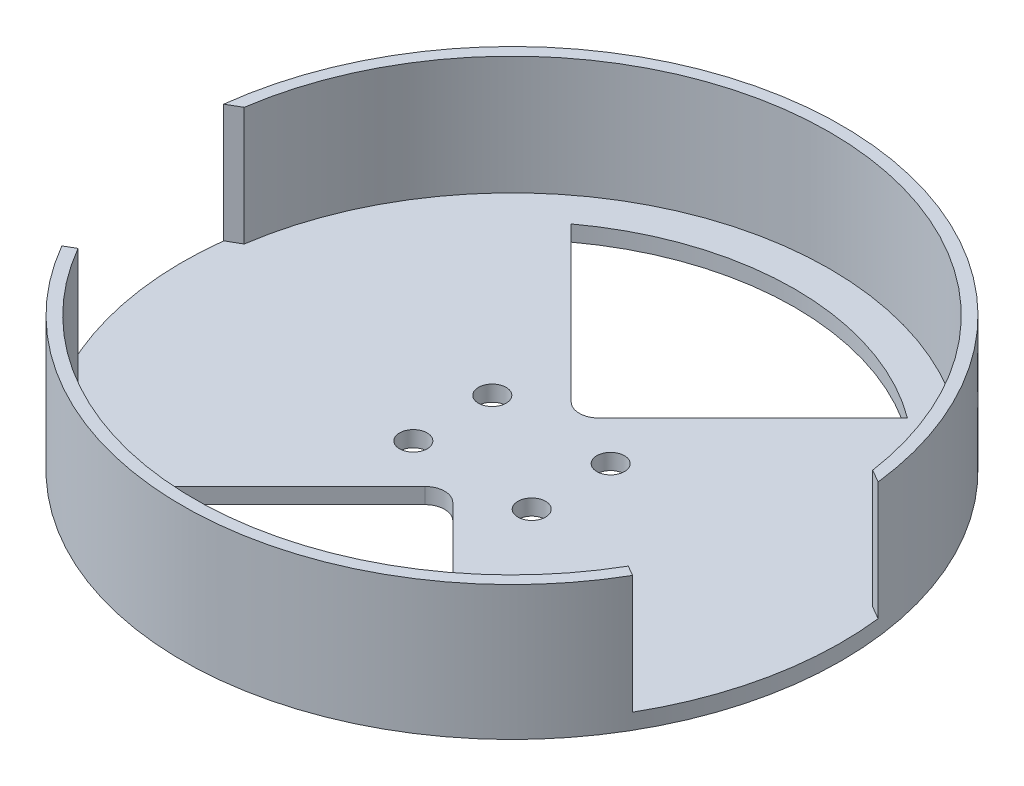
ISO-10303-21;
HEADER;
FILE_DESCRIPTION(('STEP AP214'),'2;1');
FILE_NAME('part.step','',(''),(''),'','','');
FILE_SCHEMA(('AUTOMOTIVE_DESIGN { 1 0 10303 214 1 1 1 1 }'));
ENDSEC;
DATA;
#1=APPLICATION_CONTEXT('core data for automotive mechanical design processes');
#2=APPLICATION_PROTOCOL_DEFINITION('international standard','automotive_design',2000,#1);
#3=PRODUCT_CONTEXT('',#1,'mechanical');
#4=PRODUCT('Part','Part','',(#3));
#5=PRODUCT_RELATED_PRODUCT_CATEGORY('part','',(#4));
#6=PRODUCT_DEFINITION_FORMATION('','',#4);
#7=PRODUCT_DEFINITION_CONTEXT('part definition',#1,'design');
#8=PRODUCT_DEFINITION('design','',#6,#7);
#9=PRODUCT_DEFINITION_SHAPE('','',#8);
#10=(LENGTH_UNIT() NAMED_UNIT(*) SI_UNIT(.MILLI.,.METRE.));
#11=(NAMED_UNIT(*) PLANE_ANGLE_UNIT() SI_UNIT($,.RADIAN.));
#12=(NAMED_UNIT(*) SI_UNIT($,.STERADIAN.) SOLID_ANGLE_UNIT());
#13=UNCERTAINTY_MEASURE_WITH_UNIT(LENGTH_MEASURE(1.E-05),#10,'distance_accuracy_value','');
#14=(GEOMETRIC_REPRESENTATION_CONTEXT(3) GLOBAL_UNCERTAINTY_ASSIGNED_CONTEXT((#13)) GLOBAL_UNIT_ASSIGNED_CONTEXT((#10,
#11,#12)) REPRESENTATION_CONTEXT('',''));
#15=CARTESIAN_POINT('',(0.,0.,0.));
#16=DIRECTION('',(0.,0.,1.));
#17=DIRECTION('',(1.,0.,0.));
#18=AXIS2_PLACEMENT_3D('',#15,#16,#17);
#19=CARTESIAN_POINT('',(0.,4.,0.));
#20=DIRECTION('',(0.,1.,0.));
#21=DIRECTION('',(0.,0.,1.));
#22=AXIS2_PLACEMENT_3D('',#19,#20,#21);
#23=PLANE('',#22);
#24=CARTESIAN_POINT('',(15.,4.,10.));
#25=DIRECTION('',(0.,1.,0.));
#26=DIRECTION('',(0.,0.,1.));
#27=AXIS2_PLACEMENT_3D('',#24,#25,#26);
#28=CIRCLE('',#27,3.5);
#29=CARTESIAN_POINT('',(15.,4.,13.5));
#30=VERTEX_POINT('',#29);
#31=EDGE_CURVE('E212',#30,#30,#28,.T.);
#32=ORIENTED_EDGE('',*,*,#31,.F.);
#33=EDGE_LOOP('',(#32));
#34=FACE_BOUND('',#33,.T.);
#35=CARTESIAN_POINT('',(-15.,4.,10.));
#36=DIRECTION('',(0.,1.,0.));
#37=DIRECTION('',(0.,0.,1.));
#38=AXIS2_PLACEMENT_3D('',#35,#36,#37);
#39=CIRCLE('',#38,3.5);
#40=CARTESIAN_POINT('',(-15.,4.,13.5));
#41=VERTEX_POINT('',#40);
#42=EDGE_CURVE('E596',#41,#41,#39,.T.);
#43=ORIENTED_EDGE('',*,*,#42,.F.);
#44=EDGE_LOOP('',(#43));
#45=FACE_BOUND('',#44,.T.);
#46=CARTESIAN_POINT('',(-15.,4.,-10.));
#47=DIRECTION('',(0.,1.,0.));
#48=DIRECTION('',(0.,0.,1.));
#49=AXIS2_PLACEMENT_3D('',#46,#47,#48);
#50=CIRCLE('',#49,3.5);
#51=CARTESIAN_POINT('',(-15.,4.,-6.5));
#52=VERTEX_POINT('',#51);
#53=EDGE_CURVE('E593',#52,#52,#50,.T.);
#54=ORIENTED_EDGE('',*,*,#53,.F.);
#55=EDGE_LOOP('',(#54));
#56=FACE_BOUND('',#55,.T.);
#57=CARTESIAN_POINT('',(15.,4.,-10.));
#58=DIRECTION('',(0.,1.,0.));
#59=DIRECTION('',(0.,0.,1.));
#60=AXIS2_PLACEMENT_3D('',#57,#58,#59);
#61=CIRCLE('',#60,3.5);
#62=CARTESIAN_POINT('',(15.,4.,-6.5));
#63=VERTEX_POINT('',#62);
#64=EDGE_CURVE('E590',#63,#63,#61,.T.);
#65=ORIENTED_EDGE('',*,*,#64,.F.);
#66=EDGE_LOOP('',(#65));
#67=FACE_BOUND('',#66,.T.);
#68=DIRECTION('',(-0.707106781186541,0.,-0.707106781186554));
#69=VECTOR('',#68,1.);
#70=CARTESIAN_POINT('',(7.5,4.,-7.49999999999987));
#71=LINE('',#70,#69);
#72=CARTESIAN_POINT('',(-3.53553390593271,4.,-18.5355339059328));
#73=VERTEX_POINT('',#72);
#74=CARTESIAN_POINT('',(-42.603387144329,4.,-57.6033871443298));
#75=VERTEX_POINT('',#74);
#76=EDGE_CURVE('E200',#73,#75,#71,.T.);
#77=ORIENTED_EDGE('',*,*,#76,.T.);
#78=CARTESIAN_POINT('',(0.,4.,0.));
#79=DIRECTION('',(0.,1.,0.));
#80=DIRECTION('',(0.,0.,1.));
#81=AXIS2_PLACEMENT_3D('',#78,#79,#80);
#82=CIRCLE('',#81,71.6463453825044);
#83=CARTESIAN_POINT('',(42.6033871443302,4.,-57.6033871443289));
#84=VERTEX_POINT('',#83);
#85=EDGE_CURVE('E214',#75,#84,#82,.F.);
#86=ORIENTED_EDGE('',*,*,#85,.T.);
#87=DIRECTION('',(0.707106781186559,0.,-0.707106781186536));
#88=VECTOR('',#87,1.);
#89=CARTESIAN_POINT('',(-7.5,4.,-7.50000000000024));
#90=LINE('',#89,#88);
#91=CARTESIAN_POINT('',(3.53553390593279,4.,-18.5355339059327));
#92=VERTEX_POINT('',#91);
#93=EDGE_CURVE('E204',#92,#84,#90,.T.);
#94=ORIENTED_EDGE('',*,*,#93,.F.);
#95=CARTESIAN_POINT('',(0.,4.,-22.0710678118655));
#96=DIRECTION('',(0.,1.,0.));
#97=DIRECTION('',(0.,0.,1.));
#98=AXIS2_PLACEMENT_3D('',#95,#96,#97);
#99=CIRCLE('',#98,5.);
#100=EDGE_CURVE('E210',#73,#92,#99,.T.);
#101=ORIENTED_EDGE('',*,*,#100,.F.);
#102=EDGE_LOOP('',(#77,#86,#94,#101));
#103=FACE_BOUND('',#102,.T.);
#104=CARTESIAN_POINT('',(0.,4.,0.));
#105=DIRECTION('',(0.,1.,0.));
#106=DIRECTION('',(0.,0.,1.));
#107=AXIS2_PLACEMENT_3D('',#104,#105,#106);
#108=CIRCLE('',#107,80.5);
#109=CARTESIAN_POINT('',(-79.6368694198342,4.,-11.7566589220019));
#110=VERTEX_POINT('',#109);
#111=CARTESIAN_POINT('',(79.6368694198342,4.,-11.7566589220019));
#112=VERTEX_POINT('',#111);
#113=EDGE_CURVE('E12',#110,#112,#108,.F.);
#114=ORIENTED_EDGE('',*,*,#113,.F.);
#115=DIRECTION('',(-0.866025403784436,0.,0.500000000000005));
#116=VECTOR('',#115,1.);
#117=CARTESIAN_POINT('',(-25.0000000000003,4.,-43.3012701892218));
#118=LINE('',#117,#116);
#119=CARTESIAN_POINT('',(-82.915347706804,4.,-9.86382860048751));
#120=VERTEX_POINT('',#119);
#121=EDGE_CURVE('E249',#110,#120,#118,.T.);
#122=ORIENTED_EDGE('',*,*,#121,.T.);
#123=CARTESIAN_POINT('',(0.,4.,0.));
#124=DIRECTION('',(0.,1.,0.));
#125=DIRECTION('',(0.,0.,1.));
#126=AXIS2_PLACEMENT_3D('',#123,#124,#125);
#127=CIRCLE('',#126,83.5);
#128=CARTESIAN_POINT('',(-72.3131212160004,3.99999999999999,41.7500000000004));
#129=VERTEX_POINT('',#128);
#130=EDGE_CURVE('E233',#129,#120,#127,.F.);
#131=ORIENTED_EDGE('',*,*,#130,.F.);
#132=DIRECTION('',(0.866025403784436,0.,-0.500000000000004));
#133=VECTOR('',#132,1.);
#134=CARTESIAN_POINT('',(0.,4.,0.));
#135=LINE('',#134,#133);
#136=CARTESIAN_POINT('',(-69.7150450046471,4.,40.2500000000004));
#137=VERTEX_POINT('',#136);
#138=EDGE_CURVE('E246',#129,#137,#135,.T.);
#139=ORIENTED_EDGE('',*,*,#138,.T.);
#140=CARTESIAN_POINT('',(69.7150450046472,4.,40.2500000000003));
#141=VERTEX_POINT('',#140);
#142=EDGE_CURVE('E47',#141,#137,#108,.F.);
#143=ORIENTED_EDGE('',*,*,#142,.F.);
#144=DIRECTION('',(-0.866025403784436,0.,-0.500000000000004));
#145=VECTOR('',#144,1.);
#146=CARTESIAN_POINT('',(0.,4.,0.));
#147=LINE('',#146,#145);
#148=CARTESIAN_POINT('',(72.3131212160005,4.,41.7500000000003));
#149=VERTEX_POINT('',#148);
#150=EDGE_CURVE('E223',#149,#141,#147,.T.);
#151=ORIENTED_EDGE('',*,*,#150,.F.);
#152=CARTESIAN_POINT('',(0.,4.,0.));
#153=DIRECTION('',(0.,1.,0.));
#154=DIRECTION('',(0.,0.,1.));
#155=AXIS2_PLACEMENT_3D('',#152,#153,#154);
#156=CIRCLE('',#155,83.5);
#157=CARTESIAN_POINT('',(82.915347706804,4.,-9.86382860048749));
#158=VERTEX_POINT('',#157);
#159=EDGE_CURVE('E225',#158,#149,#156,.F.);
#160=ORIENTED_EDGE('',*,*,#159,.F.);
#161=DIRECTION('',(0.866025403784436,0.,0.500000000000005));
#162=VECTOR('',#161,1.);
#163=CARTESIAN_POINT('',(25.0000000000002,4.,-43.3012701892218));
#164=LINE('',#163,#162);
#165=EDGE_CURVE('E229',#112,#158,#164,.T.);
#166=ORIENTED_EDGE('',*,*,#165,.F.);
#167=EDGE_LOOP('',(#114,#122,#131,#139,#143,#151,#160,#166));
#168=FACE_BOUND('',#167,.T.);
#169=DIRECTION('',(0.707106781186546,0.,0.707106781186549));
#170=VECTOR('',#169,1.);
#171=CARTESIAN_POINT('',(-7.5,4.,7.49999999999998));
#172=LINE('',#171,#170);
#173=CARTESIAN_POINT('',(3.53553390593275,4.,18.5355339059328));
#174=VERTEX_POINT('',#173);
#175=CARTESIAN_POINT('',(42.6033871443294,4.,57.6033871443295));
#176=VERTEX_POINT('',#175);
#177=EDGE_CURVE('E169',#174,#176,#172,.T.);
#178=ORIENTED_EDGE('',*,*,#177,.T.);
#179=CARTESIAN_POINT('',(0.,4.,0.));
#180=DIRECTION('',(0.,1.,0.));
#181=DIRECTION('',(0.,0.,1.));
#182=AXIS2_PLACEMENT_3D('',#179,#180,#181);
#183=CIRCLE('',#182,71.6463453825044);
#184=CARTESIAN_POINT('',(-42.6033871443295,4.,57.6033871443294));
#185=VERTEX_POINT('',#184);
#186=EDGE_CURVE('E156',#176,#185,#183,.F.);
#187=ORIENTED_EDGE('',*,*,#186,.T.);
#188=DIRECTION('',(-0.707106781186549,0.,0.707106781186546));
#189=VECTOR('',#188,1.);
#190=CARTESIAN_POINT('',(7.5,4.,7.50000000000002));
#191=LINE('',#190,#189);
#192=CARTESIAN_POINT('',(-3.53553390593277,4.,18.5355339059328));
#193=VERTEX_POINT('',#192);
#194=EDGE_CURVE('E184',#193,#185,#191,.T.);
#195=ORIENTED_EDGE('',*,*,#194,.F.);
#196=CARTESIAN_POINT('',(0.,4.,22.0710678118655));
#197=DIRECTION('',(0.,1.,0.));
#198=DIRECTION('',(0.,0.,1.));
#199=AXIS2_PLACEMENT_3D('',#196,#197,#198);
#200=CIRCLE('',#199,5.);
#201=EDGE_CURVE('E175',#174,#193,#200,.T.);
#202=ORIENTED_EDGE('',*,*,#201,.F.);
#203=EDGE_LOOP('',(#178,#187,#195,#202));
#204=FACE_BOUND('',#203,.T.);
#205=ADVANCED_FACE('F43',(#34,#45,#56,#67,#103,#168,#204),#23,.T.);
#206=CARTESIAN_POINT('',(0.,0.,0.));
#207=DIRECTION('',(0.,1.,0.));
#208=DIRECTION('',(0.,0.,1.));
#209=AXIS2_PLACEMENT_3D('',#206,#207,#208);
#210=PLANE('',#209);
#211=CARTESIAN_POINT('',(15.,0.,10.));
#212=DIRECTION('',(0.,-1.,0.));
#213=DIRECTION('',(0.,0.,-1.));
#214=AXIS2_PLACEMENT_3D('',#211,#212,#213);
#215=CIRCLE('',#214,3.5);
#216=CARTESIAN_POINT('',(15.,0.,6.5));
#217=VERTEX_POINT('',#216);
#218=EDGE_CURVE('E579',#217,#217,#215,.T.);
#219=ORIENTED_EDGE('',*,*,#218,.F.);
#220=EDGE_LOOP('',(#219));
#221=FACE_BOUND('',#220,.T.);
#222=CARTESIAN_POINT('',(-15.,0.,10.));
#223=DIRECTION('',(0.,-1.,0.));
#224=DIRECTION('',(0.,0.,-1.));
#225=AXIS2_PLACEMENT_3D('',#222,#223,#224);
#226=CIRCLE('',#225,3.5);
#227=CARTESIAN_POINT('',(-15.,0.,6.5));
#228=VERTEX_POINT('',#227);
#229=EDGE_CURVE('E580',#228,#228,#226,.T.);
#230=ORIENTED_EDGE('',*,*,#229,.F.);
#231=EDGE_LOOP('',(#230));
#232=FACE_BOUND('',#231,.T.);
#233=CARTESIAN_POINT('',(-15.,0.,-10.));
#234=DIRECTION('',(0.,-1.,0.));
#235=DIRECTION('',(0.,0.,-1.));
#236=AXIS2_PLACEMENT_3D('',#233,#234,#235);
#237=CIRCLE('',#236,3.5);
#238=CARTESIAN_POINT('',(-15.,0.,-13.5));
#239=VERTEX_POINT('',#238);
#240=EDGE_CURVE('E583',#239,#239,#237,.T.);
#241=ORIENTED_EDGE('',*,*,#240,.F.);
#242=EDGE_LOOP('',(#241));
#243=FACE_BOUND('',#242,.T.);
#244=CARTESIAN_POINT('',(15.,0.,-10.));
#245=DIRECTION('',(0.,-1.,0.));
#246=DIRECTION('',(0.,0.,-1.));
#247=AXIS2_PLACEMENT_3D('',#244,#245,#246);
#248=CIRCLE('',#247,3.5);
#249=CARTESIAN_POINT('',(15.,0.,-13.5));
#250=VERTEX_POINT('',#249);
#251=EDGE_CURVE('E587',#250,#250,#248,.T.);
#252=ORIENTED_EDGE('',*,*,#251,.F.);
#253=EDGE_LOOP('',(#252));
#254=FACE_BOUND('',#253,.T.);
#255=CARTESIAN_POINT('',(0.,0.,0.));
#256=DIRECTION('',(0.,1.,0.));
#257=DIRECTION('',(1.,0.,0.));
#258=AXIS2_PLACEMENT_3D('',#255,#256,#257);
#259=CIRCLE('',#258,83.5);
#260=CARTESIAN_POINT('',(83.5,0.,0.));
#261=VERTEX_POINT('',#260);
#262=EDGE_CURVE('E275',#261,#261,#259,.T.);
#263=ORIENTED_EDGE('',*,*,#262,.F.);
#264=EDGE_LOOP('',(#263));
#265=FACE_BOUND('',#264,.T.);
#266=CARTESIAN_POINT('',(0.,0.,0.));
#267=DIRECTION('',(0.,-1.,0.));
#268=DIRECTION('',(0.,0.,-1.));
#269=AXIS2_PLACEMENT_3D('',#266,#267,#268);
#270=CIRCLE('',#269,71.6463453825044);
#271=CARTESIAN_POINT('',(-42.603387144329,0.,-57.6033871443298));
#272=VERTEX_POINT('',#271);
#273=CARTESIAN_POINT('',(42.6033871443302,0.,-57.6033871443289));
#274=VERTEX_POINT('',#273);
#275=EDGE_CURVE('E197',#272,#274,#270,.T.);
#276=ORIENTED_EDGE('',*,*,#275,.F.);
#277=DIRECTION('',(-0.707106781186541,0.,-0.707106781186554));
#278=VECTOR('',#277,1.);
#279=CARTESIAN_POINT('',(7.5,0.,-7.49999999999987));
#280=LINE('',#279,#278);
#281=CARTESIAN_POINT('',(-3.53553390593271,0.,-18.5355339059328));
#282=VERTEX_POINT('',#281);
#283=EDGE_CURVE('E201',#282,#272,#280,.T.);
#284=ORIENTED_EDGE('',*,*,#283,.F.);
#285=CARTESIAN_POINT('',(0.,0.,-22.0710678118655));
#286=DIRECTION('',(0.,-1.,0.));
#287=DIRECTION('',(0.,0.,-1.));
#288=AXIS2_PLACEMENT_3D('',#285,#286,#287);
#289=CIRCLE('',#288,5.);
#290=CARTESIAN_POINT('',(3.5355339059328,0.,-18.5355339059327));
#291=VERTEX_POINT('',#290);
#292=EDGE_CURVE('E185',#282,#291,#289,.F.);
#293=ORIENTED_EDGE('',*,*,#292,.T.);
#294=DIRECTION('',(0.707106781186559,0.,-0.707106781186536));
#295=VECTOR('',#294,1.);
#296=CARTESIAN_POINT('',(-7.5,0.,-7.50000000000024));
#297=LINE('',#296,#295);
#298=EDGE_CURVE('E193',#291,#274,#297,.T.);
#299=ORIENTED_EDGE('',*,*,#298,.T.);
#300=EDGE_LOOP('',(#276,#284,#293,#299));
#301=FACE_BOUND('',#300,.T.);
#302=CARTESIAN_POINT('',(0.,0.,0.));
#303=DIRECTION('',(0.,-1.,0.));
#304=DIRECTION('',(0.,0.,-1.));
#305=AXIS2_PLACEMENT_3D('',#302,#303,#304);
#306=CIRCLE('',#305,71.6463453825044);
#307=CARTESIAN_POINT('',(42.6033871443294,0.,57.6033871443295));
#308=VERTEX_POINT('',#307);
#309=CARTESIAN_POINT('',(-42.6033871443295,0.,57.6033871443294));
#310=VERTEX_POINT('',#309);
#311=EDGE_CURVE('E176',#308,#310,#306,.T.);
#312=ORIENTED_EDGE('',*,*,#311,.F.);
#313=DIRECTION('',(0.707106781186546,0.,0.707106781186549));
#314=VECTOR('',#313,1.);
#315=CARTESIAN_POINT('',(-7.5,0.,7.49999999999998));
#316=LINE('',#315,#314);
#317=CARTESIAN_POINT('',(3.53553390593276,0.,18.5355339059328));
#318=VERTEX_POINT('',#317);
#319=EDGE_CURVE('E172',#318,#308,#316,.T.);
#320=ORIENTED_EDGE('',*,*,#319,.F.);
#321=CARTESIAN_POINT('',(0.,0.,22.0710678118655));
#322=DIRECTION('',(0.,-1.,0.));
#323=DIRECTION('',(0.,0.,-1.));
#324=AXIS2_PLACEMENT_3D('',#321,#322,#323);
#325=CIRCLE('',#324,5.);
#326=CARTESIAN_POINT('',(-3.53553390593277,0.,18.5355339059328));
#327=VERTEX_POINT('',#326);
#328=EDGE_CURVE('E181',#318,#327,#325,.F.);
#329=ORIENTED_EDGE('',*,*,#328,.T.);
#330=DIRECTION('',(-0.707106781186549,0.,0.707106781186546));
#331=VECTOR('',#330,1.);
#332=CARTESIAN_POINT('',(7.5,0.,7.50000000000002));
#333=LINE('',#332,#331);
#334=EDGE_CURVE('E190',#327,#310,#333,.T.);
#335=ORIENTED_EDGE('',*,*,#334,.T.);
#336=EDGE_LOOP('',(#312,#320,#329,#335));
#337=FACE_BOUND('',#336,.T.);
#338=ADVANCED_FACE('F45',(#221,#232,#243,#254,#265,#301,#337),#210,.F.);
#339=CARTESIAN_POINT('',(0.,34.,0.));
#340=DIRECTION('',(0.,1.,0.));
#341=DIRECTION('',(0.,0.,1.));
#342=AXIS2_PLACEMENT_3D('',#339,#340,#341);
#343=PLANE('',#342);
#344=DIRECTION('',(0.866025403784436,0.,0.500000000000004));
#345=VECTOR('',#344,1.);
#346=CARTESIAN_POINT('',(0.,34.,0.));
#347=LINE('',#346,#345);
#348=CARTESIAN_POINT('',(69.7150450046472,34.,40.2500000000003));
#349=VERTEX_POINT('',#348);
#350=CARTESIAN_POINT('',(72.3131212160005,34.,41.7500000000003));
#351=VERTEX_POINT('',#350);
#352=EDGE_CURVE('E232',#349,#351,#347,.T.);
#353=ORIENTED_EDGE('',*,*,#352,.F.);
#354=CARTESIAN_POINT('',(0.,34.,0.));
#355=DIRECTION('',(0.,1.,0.));
#356=DIRECTION('',(0.,0.,1.));
#357=AXIS2_PLACEMENT_3D('',#354,#355,#356);
#358=CIRCLE('',#357,80.5);
#359=CARTESIAN_POINT('',(-69.7150450046471,34.,40.2500000000004));
#360=VERTEX_POINT('',#359);
#361=EDGE_CURVE('E245',#360,#349,#358,.T.);
#362=ORIENTED_EDGE('',*,*,#361,.F.);
#363=DIRECTION('',(-0.866025403784436,0.,0.500000000000004));
#364=VECTOR('',#363,1.);
#365=CARTESIAN_POINT('',(0.,34.,0.));
#366=LINE('',#365,#364);
#367=CARTESIAN_POINT('',(-72.3131212160004,34.,41.7500000000004));
#368=VERTEX_POINT('',#367);
#369=EDGE_CURVE('E255',#360,#368,#366,.T.);
#370=ORIENTED_EDGE('',*,*,#369,.T.);
#371=CARTESIAN_POINT('',(0.,34.,0.));
#372=DIRECTION('',(0.,1.,0.));
#373=DIRECTION('',(1.,0.,0.));
#374=AXIS2_PLACEMENT_3D('',#371,#372,#373);
#375=CIRCLE('',#374,83.5);
#376=EDGE_CURVE('E274',#368,#351,#375,.T.);
#377=ORIENTED_EDGE('',*,*,#376,.T.);
#378=EDGE_LOOP('',(#353,#362,#370,#377));
#379=FACE_BOUND('',#378,.T.);
#380=ADVANCED_FACE('F310',(#379),#343,.T.);
#381=DIRECTION('',(-0.866025403784436,0.,-0.500000000000005));
#382=VECTOR('',#381,1.);
#383=CARTESIAN_POINT('',(25.0000000000002,34.,-43.3012701892218));
#384=LINE('',#383,#382);
#385=CARTESIAN_POINT('',(82.915347706804,34.,-9.86382860048751));
#386=VERTEX_POINT('',#385);
#387=CARTESIAN_POINT('',(79.6368694198342,34.,-11.7566589220019));
#388=VERTEX_POINT('',#387);
#389=EDGE_CURVE('E230',#386,#388,#384,.T.);
#390=ORIENTED_EDGE('',*,*,#389,.F.);
#391=CARTESIAN_POINT('',(-82.915347706804,34.,-9.86382860048751));
#392=VERTEX_POINT('',#391);
#393=EDGE_CURVE('E272',#386,#392,#375,.T.);
#394=ORIENTED_EDGE('',*,*,#393,.T.);
#395=DIRECTION('',(0.866025403784436,0.,-0.500000000000005));
#396=VECTOR('',#395,1.);
#397=CARTESIAN_POINT('',(-25.0000000000003,34.,-43.3012701892218));
#398=LINE('',#397,#396);
#399=CARTESIAN_POINT('',(-79.6368694198342,34.,-11.7566589220019));
#400=VERTEX_POINT('',#399);
#401=EDGE_CURVE('E252',#392,#400,#398,.T.);
#402=ORIENTED_EDGE('',*,*,#401,.T.);
#403=EDGE_CURVE('E271',#388,#400,#358,.T.);
#404=ORIENTED_EDGE('',*,*,#403,.F.);
#405=EDGE_LOOP('',(#390,#394,#402,#404));
#406=FACE_BOUND('',#405,.T.);
#407=ADVANCED_FACE('F289',(#406),#343,.T.);
#408=CARTESIAN_POINT('',(0.,34.,0.));
#409=DIRECTION('',(0.,-1.,0.));
#410=DIRECTION('',(0.,0.,-1.));
#411=AXIS2_PLACEMENT_3D('',#408,#409,#410);
#412=CYLINDRICAL_SURFACE('',#411,83.5);
#413=ORIENTED_EDGE('',*,*,#262,.T.);
#414=EDGE_LOOP('',(#413));
#415=FACE_BOUND('',#414,.T.);
#416=ORIENTED_EDGE('',*,*,#159,.T.);
#417=DIRECTION('',(0.,1.,0.));
#418=VECTOR('',#417,1.);
#419=CARTESIAN_POINT('',(72.3131212160005,-51.2538463205901,41.7500000000003));
#420=LINE('',#419,#418);
#421=EDGE_CURVE('E226',#149,#351,#420,.T.);
#422=ORIENTED_EDGE('',*,*,#421,.T.);
#423=ORIENTED_EDGE('',*,*,#376,.F.);
#424=DIRECTION('',(0.,1.,0.));
#425=VECTOR('',#424,1.);
#426=CARTESIAN_POINT('',(-72.3131212160004,-51.2538463205901,41.7500000000004));
#427=LINE('',#426,#425);
#428=EDGE_CURVE('E263',#129,#368,#427,.T.);
#429=ORIENTED_EDGE('',*,*,#428,.F.);
#430=ORIENTED_EDGE('',*,*,#130,.T.);
#431=DIRECTION('',(0.,1.,0.));
#432=VECTOR('',#431,1.);
#433=CARTESIAN_POINT('',(-82.915347706804,-51.2538463205901,-9.86382860048751));
#434=LINE('',#433,#432);
#435=EDGE_CURVE('E258',#120,#392,#434,.T.);
#436=ORIENTED_EDGE('',*,*,#435,.T.);
#437=ORIENTED_EDGE('',*,*,#393,.F.);
#438=DIRECTION('',(0.,1.,0.));
#439=VECTOR('',#438,1.);
#440=CARTESIAN_POINT('',(82.915347706804,-51.2538463205901,-9.86382860048751));
#441=LINE('',#440,#439);
#442=EDGE_CURVE('E235',#158,#386,#441,.T.);
#443=ORIENTED_EDGE('',*,*,#442,.F.);
#444=EDGE_LOOP('',(#416,#422,#423,#429,#430,#436,#437,#443));
#445=FACE_BOUND('',#444,.T.);
#446=ADVANCED_FACE('F295',(#415,#445),#412,.T.);
#447=CARTESIAN_POINT('',(0.,34.,0.));
#448=DIRECTION('',(0.,-1.,0.));
#449=DIRECTION('',(0.,0.,-1.));
#450=AXIS2_PLACEMENT_3D('',#447,#448,#449);
#451=CYLINDRICAL_SURFACE('',#450,80.5);
#452=DIRECTION('',(0.,1.,0.));
#453=VECTOR('',#452,1.);
#454=CARTESIAN_POINT('',(69.7150450046472,-51.2538463205901,40.2500000000003));
#455=LINE('',#454,#453);
#456=EDGE_CURVE('E238',#141,#349,#455,.T.);
#457=ORIENTED_EDGE('',*,*,#456,.F.);
#458=ORIENTED_EDGE('',*,*,#142,.T.);
#459=DIRECTION('',(0.,1.,0.));
#460=VECTOR('',#459,1.);
#461=CARTESIAN_POINT('',(-69.7150450046471,-51.2538463205901,40.2500000000004));
#462=LINE('',#461,#460);
#463=EDGE_CURVE('E260',#137,#360,#462,.T.);
#464=ORIENTED_EDGE('',*,*,#463,.T.);
#465=ORIENTED_EDGE('',*,*,#361,.T.);
#466=EDGE_LOOP('',(#457,#458,#464,#465));
#467=FACE_BOUND('',#466,.T.);
#468=ADVANCED_FACE('F316',(#467),#451,.F.);
#469=DIRECTION('',(0.,1.,0.));
#470=VECTOR('',#469,1.);
#471=CARTESIAN_POINT('',(79.6368694198342,-51.2538463205901,-11.7566589220019));
#472=LINE('',#471,#470);
#473=EDGE_CURVE('E240',#112,#388,#472,.T.);
#474=ORIENTED_EDGE('',*,*,#473,.T.);
#475=ORIENTED_EDGE('',*,*,#403,.T.);
#476=DIRECTION('',(0.,1.,0.));
#477=VECTOR('',#476,1.);
#478=CARTESIAN_POINT('',(-79.6368694198342,-51.2538463205901,-11.7566589220019));
#479=LINE('',#478,#477);
#480=EDGE_CURVE('E250',#110,#400,#479,.T.);
#481=ORIENTED_EDGE('',*,*,#480,.F.);
#482=ORIENTED_EDGE('',*,*,#113,.T.);
#483=EDGE_LOOP('',(#474,#475,#481,#482));
#484=FACE_BOUND('',#483,.T.);
#485=ADVANCED_FACE('F284',(#484),#451,.F.);
#486=CARTESIAN_POINT('',(-25.0000000000003,-51.2538463205901,-43.3012701892218));
#487=DIRECTION('',(0.500000000000005,0.,0.866025403784436));
#488=DIRECTION('',(0.866025403784436,0.,-0.500000000000005));
#489=AXIS2_PLACEMENT_3D('',#486,#487,#488);
#490=PLANE('',#489);
#491=ORIENTED_EDGE('',*,*,#480,.T.);
#492=ORIENTED_EDGE('',*,*,#401,.F.);
#493=ORIENTED_EDGE('',*,*,#435,.F.);
#494=ORIENTED_EDGE('',*,*,#121,.F.);
#495=EDGE_LOOP('',(#491,#492,#493,#494));
#496=FACE_BOUND('',#495,.T.);
#497=ADVANCED_FACE('F293',(#496),#490,.T.);
#498=CARTESIAN_POINT('',(0.,-51.2538463205901,0.));
#499=DIRECTION('',(-0.500000000000004,0.,-0.866025403784436));
#500=DIRECTION('',(-0.866025403784436,0.,0.500000000000004));
#501=AXIS2_PLACEMENT_3D('',#498,#499,#500);
#502=PLANE('',#501);
#503=ORIENTED_EDGE('',*,*,#428,.T.);
#504=ORIENTED_EDGE('',*,*,#369,.F.);
#505=ORIENTED_EDGE('',*,*,#463,.F.);
#506=ORIENTED_EDGE('',*,*,#138,.F.);
#507=EDGE_LOOP('',(#503,#504,#505,#506));
#508=FACE_BOUND('',#507,.T.);
#509=ADVANCED_FACE('F313',(#508),#502,.T.);
#510=CARTESIAN_POINT('',(0.,-51.2538463205901,0.));
#511=DIRECTION('',(-0.500000000000004,0.,0.866025403784436));
#512=DIRECTION('',(0.866025403784436,0.,0.500000000000004));
#513=AXIS2_PLACEMENT_3D('',#510,#511,#512);
#514=PLANE('',#513);
#515=ORIENTED_EDGE('',*,*,#150,.T.);
#516=ORIENTED_EDGE('',*,*,#456,.T.);
#517=ORIENTED_EDGE('',*,*,#352,.T.);
#518=ORIENTED_EDGE('',*,*,#421,.F.);
#519=EDGE_LOOP('',(#515,#516,#517,#518));
#520=FACE_BOUND('',#519,.T.);
#521=ADVANCED_FACE('F317',(#520),#514,.F.);
#522=CARTESIAN_POINT('',(25.0000000000002,-51.2538463205901,-43.3012701892218));
#523=DIRECTION('',(0.500000000000004,0.,-0.866025403784436));
#524=DIRECTION('',(-0.866025403784436,0.,-0.500000000000005));
#525=AXIS2_PLACEMENT_3D('',#522,#523,#524);
#526=PLANE('',#525);
#527=ORIENTED_EDGE('',*,*,#165,.T.);
#528=ORIENTED_EDGE('',*,*,#442,.T.);
#529=ORIENTED_EDGE('',*,*,#389,.T.);
#530=ORIENTED_EDGE('',*,*,#473,.F.);
#531=EDGE_LOOP('',(#527,#528,#529,#530));
#532=FACE_BOUND('',#531,.T.);
#533=ADVANCED_FACE('F305',(#532),#526,.F.);
#534=CARTESIAN_POINT('',(7.5,105.186240697986,-7.49999999999987));
#535=DIRECTION('',(-0.707106781186554,0.,0.707106781186541));
#536=DIRECTION('',(0.707106781186541,0.,0.707106781186554));
#537=AXIS2_PLACEMENT_3D('',#534,#535,#536);
#538=PLANE('',#537);
#539=DIRECTION('',(0.,-1.,0.));
#540=VECTOR('',#539,1.);
#541=CARTESIAN_POINT('',(-3.53553390593271,105.186240697986,-18.5355339059328));
#542=LINE('',#541,#540);
#543=EDGE_CURVE('E66',#73,#282,#542,.T.);
#544=ORIENTED_EDGE('',*,*,#543,.T.);
#545=ORIENTED_EDGE('',*,*,#283,.T.);
#546=DIRECTION('',(0.,-1.,0.));
#547=VECTOR('',#546,1.);
#548=CARTESIAN_POINT('',(-42.603387144329,105.186240697986,-57.6033871443298));
#549=LINE('',#548,#547);
#550=EDGE_CURVE('E209',#75,#272,#549,.T.);
#551=ORIENTED_EDGE('',*,*,#550,.F.);
#552=ORIENTED_EDGE('',*,*,#76,.F.);
#553=EDGE_LOOP('',(#544,#545,#551,#552));
#554=FACE_BOUND('',#553,.T.);
#555=ADVANCED_FACE('F324',(#554),#538,.F.);
#556=CARTESIAN_POINT('',(0.,105.186240697986,0.));
#557=DIRECTION('',(0.,-1.,0.));
#558=DIRECTION('',(0.,0.,-1.));
#559=AXIS2_PLACEMENT_3D('',#556,#557,#558);
#560=CYLINDRICAL_SURFACE('',#559,71.6463453825044);
#561=ORIENTED_EDGE('',*,*,#550,.T.);
#562=ORIENTED_EDGE('',*,*,#275,.T.);
#563=DIRECTION('',(0.,-1.,0.));
#564=VECTOR('',#563,1.);
#565=CARTESIAN_POINT('',(42.6033871443302,105.186240697986,-57.6033871443289));
#566=LINE('',#565,#564);
#567=EDGE_CURVE('E217',#84,#274,#566,.T.);
#568=ORIENTED_EDGE('',*,*,#567,.F.);
#569=ORIENTED_EDGE('',*,*,#85,.F.);
#570=EDGE_LOOP('',(#561,#562,#568,#569));
#571=FACE_BOUND('',#570,.T.);
#572=ADVANCED_FACE('F392',(#571),#560,.F.);
#573=CARTESIAN_POINT('',(-7.5,105.186240697986,-7.50000000000024));
#574=DIRECTION('',(-0.707106781186536,0.,-0.707106781186559));
#575=DIRECTION('',(-0.707106781186559,0.,0.707106781186536));
#576=AXIS2_PLACEMENT_3D('',#573,#574,#575);
#577=PLANE('',#576);
#578=ORIENTED_EDGE('',*,*,#93,.T.);
#579=ORIENTED_EDGE('',*,*,#567,.T.);
#580=ORIENTED_EDGE('',*,*,#298,.F.);
#581=DIRECTION('',(0.,-1.,0.));
#582=VECTOR('',#581,1.);
#583=CARTESIAN_POINT('',(3.53553390593279,105.186240697986,-18.5355339059327));
#584=LINE('',#583,#582);
#585=EDGE_CURVE('E196',#92,#291,#584,.T.);
#586=ORIENTED_EDGE('',*,*,#585,.F.);
#587=EDGE_LOOP('',(#578,#579,#580,#586));
#588=FACE_BOUND('',#587,.T.);
#589=ADVANCED_FACE('F403',(#588),#577,.T.);
#590=CARTESIAN_POINT('',(0.,105.186240697986,-22.0710678118655));
#591=DIRECTION('',(0.,-1.,0.));
#592=DIRECTION('',(0.,0.,-1.));
#593=AXIS2_PLACEMENT_3D('',#590,#591,#592);
#594=CYLINDRICAL_SURFACE('',#593,5.);
#595=ORIENTED_EDGE('',*,*,#100,.T.);
#596=ORIENTED_EDGE('',*,*,#585,.T.);
#597=ORIENTED_EDGE('',*,*,#292,.F.);
#598=ORIENTED_EDGE('',*,*,#543,.F.);
#599=EDGE_LOOP('',(#595,#596,#597,#598));
#600=FACE_BOUND('',#599,.T.);
#601=ADVANCED_FACE('F414',(#600),#594,.F.);
#602=CARTESIAN_POINT('',(-7.5,105.186240697986,7.49999999999998));
#603=DIRECTION('',(0.707106781186549,0.,-0.707106781186546));
#604=DIRECTION('',(-0.707106781186546,0.,-0.707106781186549));
#605=AXIS2_PLACEMENT_3D('',#602,#603,#604);
#606=PLANE('',#605);
#607=DIRECTION('',(0.,-1.,0.));
#608=VECTOR('',#607,1.);
#609=CARTESIAN_POINT('',(3.53553390593276,105.186240697986,18.5355339059328));
#610=LINE('',#609,#608);
#611=EDGE_CURVE('E58',#174,#318,#610,.T.);
#612=ORIENTED_EDGE('',*,*,#611,.T.);
#613=ORIENTED_EDGE('',*,*,#319,.T.);
#614=DIRECTION('',(0.,-1.,0.));
#615=VECTOR('',#614,1.);
#616=CARTESIAN_POINT('',(42.6033871443294,105.186240697986,57.6033871443295));
#617=LINE('',#616,#615);
#618=EDGE_CURVE('E160',#176,#308,#617,.T.);
#619=ORIENTED_EDGE('',*,*,#618,.F.);
#620=ORIENTED_EDGE('',*,*,#177,.F.);
#621=EDGE_LOOP('',(#612,#613,#619,#620));
#622=FACE_BOUND('',#621,.T.);
#623=ADVANCED_FACE('F168',(#622),#606,.F.);
#624=CARTESIAN_POINT('',(0.,105.186240697986,0.));
#625=DIRECTION('',(0.,-1.,0.));
#626=DIRECTION('',(0.,0.,-1.));
#627=AXIS2_PLACEMENT_3D('',#624,#625,#626);
#628=CYLINDRICAL_SURFACE('',#627,71.6463453825044);
#629=ORIENTED_EDGE('',*,*,#618,.T.);
#630=ORIENTED_EDGE('',*,*,#311,.T.);
#631=DIRECTION('',(0.,-1.,0.));
#632=VECTOR('',#631,1.);
#633=CARTESIAN_POINT('',(-42.6033871443295,105.186240697986,57.6033871443294));
#634=LINE('',#633,#632);
#635=EDGE_CURVE('E162',#185,#310,#634,.T.);
#636=ORIENTED_EDGE('',*,*,#635,.F.);
#637=ORIENTED_EDGE('',*,*,#186,.F.);
#638=EDGE_LOOP('',(#629,#630,#636,#637));
#639=FACE_BOUND('',#638,.T.);
#640=ADVANCED_FACE('F158',(#639),#628,.F.);
#641=CARTESIAN_POINT('',(7.5,105.186240697986,7.50000000000002));
#642=DIRECTION('',(0.707106781186546,0.,0.707106781186549));
#643=DIRECTION('',(0.707106781186549,0.,-0.707106781186546));
#644=AXIS2_PLACEMENT_3D('',#641,#642,#643);
#645=PLANE('',#644);
#646=ORIENTED_EDGE('',*,*,#194,.T.);
#647=ORIENTED_EDGE('',*,*,#635,.T.);
#648=ORIENTED_EDGE('',*,*,#334,.F.);
#649=DIRECTION('',(0.,-1.,0.));
#650=VECTOR('',#649,1.);
#651=CARTESIAN_POINT('',(-3.53553390593277,105.186240697986,18.5355339059328));
#652=LINE('',#651,#650);
#653=EDGE_CURVE('E187',#193,#327,#652,.T.);
#654=ORIENTED_EDGE('',*,*,#653,.F.);
#655=EDGE_LOOP('',(#646,#647,#648,#654));
#656=FACE_BOUND('',#655,.T.);
#657=ADVANCED_FACE('F443',(#656),#645,.T.);
#658=CARTESIAN_POINT('',(0.,105.186240697986,22.0710678118655));
#659=DIRECTION('',(0.,-1.,0.));
#660=DIRECTION('',(0.,0.,-1.));
#661=AXIS2_PLACEMENT_3D('',#658,#659,#660);
#662=CYLINDRICAL_SURFACE('',#661,5.);
#663=ORIENTED_EDGE('',*,*,#201,.T.);
#664=ORIENTED_EDGE('',*,*,#653,.T.);
#665=ORIENTED_EDGE('',*,*,#328,.F.);
#666=ORIENTED_EDGE('',*,*,#611,.F.);
#667=EDGE_LOOP('',(#663,#664,#665,#666));
#668=FACE_BOUND('',#667,.T.);
#669=ADVANCED_FACE('F453',(#668),#662,.F.);
#670=CARTESIAN_POINT('',(15.,10.,-10.));
#671=DIRECTION('',(0.,-1.,0.));
#672=DIRECTION('',(0.,0.,-1.));
#673=AXIS2_PLACEMENT_3D('',#670,#671,#672);
#674=CYLINDRICAL_SURFACE('',#673,3.5);
#675=ORIENTED_EDGE('',*,*,#64,.T.);
#676=EDGE_LOOP('',(#675));
#677=FACE_BOUND('',#676,.T.);
#678=ORIENTED_EDGE('',*,*,#251,.T.);
#679=EDGE_LOOP('',(#678));
#680=FACE_BOUND('',#679,.T.);
#681=ADVANCED_FACE('F463',(#677,#680),#674,.F.);
#682=CARTESIAN_POINT('',(-15.,10.,-10.));
#683=DIRECTION('',(0.,-1.,0.));
#684=DIRECTION('',(0.,0.,-1.));
#685=AXIS2_PLACEMENT_3D('',#682,#683,#684);
#686=CYLINDRICAL_SURFACE('',#685,3.5);
#687=ORIENTED_EDGE('',*,*,#53,.T.);
#688=EDGE_LOOP('',(#687));
#689=FACE_BOUND('',#688,.T.);
#690=ORIENTED_EDGE('',*,*,#240,.T.);
#691=EDGE_LOOP('',(#690));
#692=FACE_BOUND('',#691,.T.);
#693=ADVANCED_FACE('F472',(#689,#692),#686,.F.);
#694=CARTESIAN_POINT('',(-15.,10.,10.));
#695=DIRECTION('',(0.,-1.,0.));
#696=DIRECTION('',(0.,0.,-1.));
#697=AXIS2_PLACEMENT_3D('',#694,#695,#696);
#698=CYLINDRICAL_SURFACE('',#697,3.5);
#699=ORIENTED_EDGE('',*,*,#42,.T.);
#700=EDGE_LOOP('',(#699));
#701=FACE_BOUND('',#700,.T.);
#702=ORIENTED_EDGE('',*,*,#229,.T.);
#703=EDGE_LOOP('',(#702));
#704=FACE_BOUND('',#703,.T.);
#705=ADVANCED_FACE('F483',(#701,#704),#698,.F.);
#706=CARTESIAN_POINT('',(15.,10.,10.));
#707=DIRECTION('',(0.,-1.,0.));
#708=DIRECTION('',(0.,0.,-1.));
#709=AXIS2_PLACEMENT_3D('',#706,#707,#708);
#710=CYLINDRICAL_SURFACE('',#709,3.5);
#711=ORIENTED_EDGE('',*,*,#31,.T.);
#712=EDGE_LOOP('',(#711));
#713=FACE_BOUND('',#712,.T.);
#714=ORIENTED_EDGE('',*,*,#218,.T.);
#715=EDGE_LOOP('',(#714));
#716=FACE_BOUND('',#715,.T.);
#717=ADVANCED_FACE('F494',(#713,#716),#710,.F.);
#718=CLOSED_SHELL('',(#205,#338,#380,#407,#446,#468,#485,#497,#509,#521,#533,#555,#572,#589,
#601,#623,#640,#657,#669,#681,#693,#705,#717));
#719=MANIFOLD_SOLID_BREP('B2',#718);
#720=ADVANCED_BREP_SHAPE_REPRESENTATION('',(#18,#719),#14);
#721=SHAPE_DEFINITION_REPRESENTATION(#9,#720);
ENDSEC;
END-ISO-10303-21;
